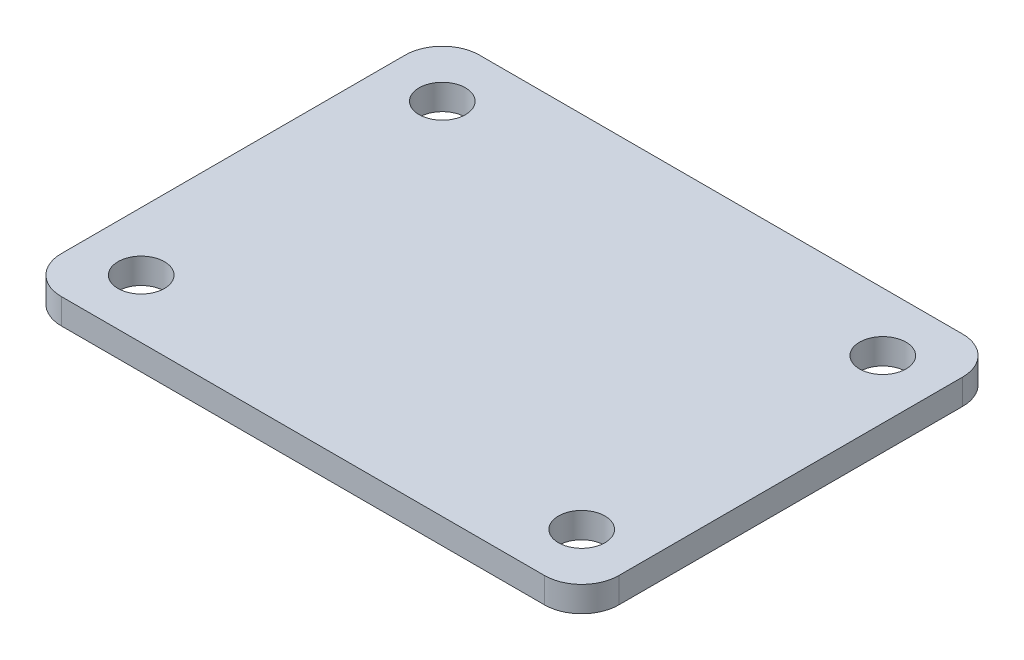
ISO-10303-21;
HEADER;
FILE_DESCRIPTION(('STEP AP214'),'2;1');
FILE_NAME('part.step','',(''),(''),'','','');
FILE_SCHEMA(('AUTOMOTIVE_DESIGN { 1 0 10303 214 1 1 1 1 }'));
ENDSEC;
DATA;
#1=APPLICATION_CONTEXT('core data for automotive mechanical design processes');
#2=APPLICATION_PROTOCOL_DEFINITION('international standard','automotive_design',2000,#1);
#3=PRODUCT_CONTEXT('',#1,'mechanical');
#4=PRODUCT('Part','Part','',(#3));
#5=PRODUCT_RELATED_PRODUCT_CATEGORY('part','',(#4));
#6=PRODUCT_DEFINITION_FORMATION('','',#4);
#7=PRODUCT_DEFINITION_CONTEXT('part definition',#1,'design');
#8=PRODUCT_DEFINITION('design','',#6,#7);
#9=PRODUCT_DEFINITION_SHAPE('','',#8);
#10=(LENGTH_UNIT() NAMED_UNIT(*) SI_UNIT(.MILLI.,.METRE.));
#11=(NAMED_UNIT(*) PLANE_ANGLE_UNIT() SI_UNIT($,.RADIAN.));
#12=(NAMED_UNIT(*) SI_UNIT($,.STERADIAN.) SOLID_ANGLE_UNIT());
#13=UNCERTAINTY_MEASURE_WITH_UNIT(LENGTH_MEASURE(1.E-05),#10,'distance_accuracy_value','');
#14=(GEOMETRIC_REPRESENTATION_CONTEXT(3) GLOBAL_UNCERTAINTY_ASSIGNED_CONTEXT((#13)) GLOBAL_UNIT_ASSIGNED_CONTEXT((#10,
#11,#12)) REPRESENTATION_CONTEXT('',''));
#15=CARTESIAN_POINT('',(0.,0.,0.));
#16=DIRECTION('',(0.,0.,1.));
#17=DIRECTION('',(1.,0.,0.));
#18=AXIS2_PLACEMENT_3D('',#15,#16,#17);
#19=CARTESIAN_POINT('',(0.,1.7399,0.));
#20=DIRECTION('',(1.,0.,0.));
#21=DIRECTION('',(0.,0.,-1.));
#22=AXIS2_PLACEMENT_3D('',#19,#20,#21);
#23=PLANE('',#22);
#24=DIRECTION('',(0.,0.,1.));
#25=VECTOR('',#24,1.);
#26=CARTESIAN_POINT('',(0.,0.,0.));
#27=LINE('',#26,#25);
#28=CARTESIAN_POINT('',(0.,0.,-26.035));
#29=VERTEX_POINT('',#28);
#30=CARTESIAN_POINT('',(0.,0.,-2.54));
#31=VERTEX_POINT('',#30);
#32=EDGE_CURVE('E186',#29,#31,#27,.T.);
#33=ORIENTED_EDGE('',*,*,#32,.T.);
#34=DIRECTION('',(0.,-1.,0.));
#35=VECTOR('',#34,1.);
#36=CARTESIAN_POINT('',(0.,1.7399,-2.54));
#37=LINE('',#36,#35);
#38=CARTESIAN_POINT('',(0.,1.7399,-2.54));
#39=VERTEX_POINT('',#38);
#40=EDGE_CURVE('E11',#31,#39,#37,.F.);
#41=ORIENTED_EDGE('',*,*,#40,.T.);
#42=DIRECTION('',(0.,0.,1.));
#43=VECTOR('',#42,1.);
#44=CARTESIAN_POINT('',(0.,1.7399,0.));
#45=LINE('',#44,#43);
#46=CARTESIAN_POINT('',(0.,1.7399,-26.035));
#47=VERTEX_POINT('',#46);
#48=EDGE_CURVE('E139',#47,#39,#45,.T.);
#49=ORIENTED_EDGE('',*,*,#48,.F.);
#50=DIRECTION('',(0.,-1.,0.));
#51=VECTOR('',#50,1.);
#52=CARTESIAN_POINT('',(0.,1.7399,-26.035));
#53=LINE('',#52,#51);
#54=EDGE_CURVE('E52',#47,#29,#53,.T.);
#55=ORIENTED_EDGE('',*,*,#54,.T.);
#56=EDGE_LOOP('',(#33,#41,#49,#55));
#57=FACE_BOUND('',#56,.T.);
#58=ADVANCED_FACE('F43',(#57),#23,.F.);
#59=CARTESIAN_POINT('',(0.,1.7399,0.));
#60=DIRECTION('',(0.,0.,-1.));
#61=DIRECTION('',(-1.,0.,0.));
#62=AXIS2_PLACEMENT_3D('',#59,#60,#61);
#63=PLANE('',#62);
#64=DIRECTION('',(1.,0.,0.));
#65=VECTOR('',#64,1.);
#66=CARTESIAN_POINT('',(0.,0.,0.));
#67=LINE('',#66,#65);
#68=CARTESIAN_POINT('',(2.54,0.,0.));
#69=VERTEX_POINT('',#68);
#70=CARTESIAN_POINT('',(35.56,0.,0.));
#71=VERTEX_POINT('',#70);
#72=EDGE_CURVE('E146',#69,#71,#67,.T.);
#73=ORIENTED_EDGE('',*,*,#72,.T.);
#74=DIRECTION('',(0.,-1.,0.));
#75=VECTOR('',#74,1.);
#76=CARTESIAN_POINT('',(35.56,1.7399,0.));
#77=LINE('',#76,#75);
#78=CARTESIAN_POINT('',(35.56,1.7399,0.));
#79=VERTEX_POINT('',#78);
#80=EDGE_CURVE('E59',#71,#79,#77,.F.);
#81=ORIENTED_EDGE('',*,*,#80,.T.);
#82=DIRECTION('',(1.,0.,0.));
#83=VECTOR('',#82,1.);
#84=CARTESIAN_POINT('',(0.,1.7399,0.));
#85=LINE('',#84,#83);
#86=CARTESIAN_POINT('',(2.54,1.7399,0.));
#87=VERTEX_POINT('',#86);
#88=EDGE_CURVE('E144',#87,#79,#85,.T.);
#89=ORIENTED_EDGE('',*,*,#88,.F.);
#90=DIRECTION('',(0.,-1.,0.));
#91=VECTOR('',#90,1.);
#92=CARTESIAN_POINT('',(2.54,1.7399,0.));
#93=LINE('',#92,#91);
#94=EDGE_CURVE('E175',#87,#69,#93,.T.);
#95=ORIENTED_EDGE('',*,*,#94,.T.);
#96=EDGE_LOOP('',(#73,#81,#89,#95));
#97=FACE_BOUND('',#96,.T.);
#98=ADVANCED_FACE('F251',(#97),#63,.F.);
#99=CARTESIAN_POINT('',(38.1,1.7399,0.));
#100=DIRECTION('',(-1.,0.,0.));
#101=DIRECTION('',(0.,0.,1.));
#102=AXIS2_PLACEMENT_3D('',#99,#100,#101);
#103=PLANE('',#102);
#104=DIRECTION('',(0.,0.,-1.));
#105=VECTOR('',#104,1.);
#106=CARTESIAN_POINT('',(38.1,0.,0.));
#107=LINE('',#106,#105);
#108=CARTESIAN_POINT('',(38.1,0.,-2.54));
#109=VERTEX_POINT('',#108);
#110=CARTESIAN_POINT('',(38.1,0.,-26.035));
#111=VERTEX_POINT('',#110);
#112=EDGE_CURVE('E140',#109,#111,#107,.T.);
#113=ORIENTED_EDGE('',*,*,#112,.T.);
#114=DIRECTION('',(0.,-1.,0.));
#115=VECTOR('',#114,1.);
#116=CARTESIAN_POINT('',(38.1,1.7399,-26.035));
#117=LINE('',#116,#115);
#118=CARTESIAN_POINT('',(38.1,1.7399,-26.035));
#119=VERTEX_POINT('',#118);
#120=EDGE_CURVE('E115',#111,#119,#117,.F.);
#121=ORIENTED_EDGE('',*,*,#120,.T.);
#122=DIRECTION('',(0.,0.,-1.));
#123=VECTOR('',#122,1.);
#124=CARTESIAN_POINT('',(38.1,1.7399,0.));
#125=LINE('',#124,#123);
#126=CARTESIAN_POINT('',(38.1,1.7399,-2.54));
#127=VERTEX_POINT('',#126);
#128=EDGE_CURVE('E202',#127,#119,#125,.T.);
#129=ORIENTED_EDGE('',*,*,#128,.F.);
#130=DIRECTION('',(0.,-1.,0.));
#131=VECTOR('',#130,1.);
#132=CARTESIAN_POINT('',(38.1,1.7399,-2.54));
#133=LINE('',#132,#131);
#134=EDGE_CURVE('E121',#127,#109,#133,.T.);
#135=ORIENTED_EDGE('',*,*,#134,.T.);
#136=EDGE_LOOP('',(#113,#121,#129,#135));
#137=FACE_BOUND('',#136,.T.);
#138=ADVANCED_FACE('F248',(#137),#103,.F.);
#139=CARTESIAN_POINT('',(0.,1.7399,-28.575));
#140=DIRECTION('',(0.,0.,1.));
#141=DIRECTION('',(1.,0.,0.));
#142=AXIS2_PLACEMENT_3D('',#139,#140,#141);
#143=PLANE('',#142);
#144=DIRECTION('',(-1.,0.,0.));
#145=VECTOR('',#144,1.);
#146=CARTESIAN_POINT('',(0.,1.7399,-28.575));
#147=LINE('',#146,#145);
#148=CARTESIAN_POINT('',(35.56,1.7399,-28.575));
#149=VERTEX_POINT('',#148);
#150=CARTESIAN_POINT('',(2.54,1.7399,-28.575));
#151=VERTEX_POINT('',#150);
#152=EDGE_CURVE('E131',#149,#151,#147,.T.);
#153=ORIENTED_EDGE('',*,*,#152,.F.);
#154=DIRECTION('',(0.,-1.,0.));
#155=VECTOR('',#154,1.);
#156=CARTESIAN_POINT('',(35.56,1.7399,-28.575));
#157=LINE('',#156,#155);
#158=CARTESIAN_POINT('',(35.56,0.,-28.575));
#159=VERTEX_POINT('',#158);
#160=EDGE_CURVE('E114',#149,#159,#157,.T.);
#161=ORIENTED_EDGE('',*,*,#160,.T.);
#162=DIRECTION('',(-1.,0.,0.));
#163=VECTOR('',#162,1.);
#164=CARTESIAN_POINT('',(0.,0.,-28.575));
#165=LINE('',#164,#163);
#166=CARTESIAN_POINT('',(2.54,0.,-28.575));
#167=VERTEX_POINT('',#166);
#168=EDGE_CURVE('E128',#159,#167,#165,.T.);
#169=ORIENTED_EDGE('',*,*,#168,.T.);
#170=DIRECTION('',(0.,-1.,0.));
#171=VECTOR('',#170,1.);
#172=CARTESIAN_POINT('',(2.54,1.7399,-28.575));
#173=LINE('',#172,#171);
#174=EDGE_CURVE('E134',#167,#151,#173,.F.);
#175=ORIENTED_EDGE('',*,*,#174,.T.);
#176=EDGE_LOOP('',(#153,#161,#169,#175));
#177=FACE_BOUND('',#176,.T.);
#178=ADVANCED_FACE('F127',(#177),#143,.F.);
#179=CARTESIAN_POINT('',(0.,1.7399,0.));
#180=DIRECTION('',(0.,-1.,0.));
#181=DIRECTION('',(0.,0.,-1.));
#182=AXIS2_PLACEMENT_3D('',#179,#180,#181);
#183=PLANE('',#182);
#184=CARTESIAN_POINT('',(34.0995,1.7399,-4.0005));
#185=DIRECTION('',(0.,1.,0.));
#186=DIRECTION('',(0.,0.,1.));
#187=AXIS2_PLACEMENT_3D('',#184,#185,#186);
#188=CIRCLE('',#187,1.5875);
#189=CARTESIAN_POINT('',(34.0995,1.7399,-2.413));
#190=VERTEX_POINT('',#189);
#191=EDGE_CURVE('E210',#190,#190,#188,.T.);
#192=ORIENTED_EDGE('',*,*,#191,.F.);
#193=EDGE_LOOP('',(#192));
#194=FACE_BOUND('',#193,.T.);
#195=CARTESIAN_POINT('',(4.0005,1.7399,-24.5745));
#196=DIRECTION('',(0.,1.,0.));
#197=DIRECTION('',(0.,0.,1.));
#198=AXIS2_PLACEMENT_3D('',#195,#196,#197);
#199=CIRCLE('',#198,1.5875);
#200=CARTESIAN_POINT('',(4.0005,1.7399,-22.987));
#201=VERTEX_POINT('',#200);
#202=EDGE_CURVE('E216',#201,#201,#199,.T.);
#203=ORIENTED_EDGE('',*,*,#202,.F.);
#204=EDGE_LOOP('',(#203));
#205=FACE_BOUND('',#204,.T.);
#206=CARTESIAN_POINT('',(34.0995,1.7399,-24.5745));
#207=DIRECTION('',(0.,1.,0.));
#208=DIRECTION('',(0.,0.,1.));
#209=AXIS2_PLACEMENT_3D('',#206,#207,#208);
#210=CIRCLE('',#209,1.5875);
#211=CARTESIAN_POINT('',(34.0995,1.7399,-22.987));
#212=VERTEX_POINT('',#211);
#213=EDGE_CURVE('E217',#212,#212,#210,.T.);
#214=ORIENTED_EDGE('',*,*,#213,.F.);
#215=EDGE_LOOP('',(#214));
#216=FACE_BOUND('',#215,.T.);
#217=CARTESIAN_POINT('',(4.0005,1.7399,-4.0005));
#218=DIRECTION('',(0.,1.,0.));
#219=DIRECTION('',(0.,0.,1.));
#220=AXIS2_PLACEMENT_3D('',#217,#218,#219);
#221=CIRCLE('',#220,1.5875);
#222=CARTESIAN_POINT('',(4.0005,1.7399,-2.413));
#223=VERTEX_POINT('',#222);
#224=EDGE_CURVE('E197',#223,#223,#221,.T.);
#225=ORIENTED_EDGE('',*,*,#224,.F.);
#226=EDGE_LOOP('',(#225));
#227=FACE_BOUND('',#226,.T.);
#228=ORIENTED_EDGE('',*,*,#128,.T.);
#229=CARTESIAN_POINT('',(35.56,1.7399,-26.035));
#230=DIRECTION('',(0.,-1.,0.));
#231=DIRECTION('',(0.,0.,-1.));
#232=AXIS2_PLACEMENT_3D('',#229,#230,#231);
#233=CIRCLE('',#232,2.54);
#234=EDGE_CURVE('E172',#119,#149,#233,.F.);
#235=ORIENTED_EDGE('',*,*,#234,.T.);
#236=ORIENTED_EDGE('',*,*,#152,.T.);
#237=CARTESIAN_POINT('',(2.54,1.7399,-26.035));
#238=DIRECTION('',(0.,-1.,0.));
#239=DIRECTION('',(0.,0.,-1.));
#240=AXIS2_PLACEMENT_3D('',#237,#238,#239);
#241=CIRCLE('',#240,2.54);
#242=EDGE_CURVE('E164',#151,#47,#241,.F.);
#243=ORIENTED_EDGE('',*,*,#242,.T.);
#244=ORIENTED_EDGE('',*,*,#48,.T.);
#245=CARTESIAN_POINT('',(2.54,1.7399,-2.54));
#246=DIRECTION('',(0.,-1.,0.));
#247=DIRECTION('',(0.,0.,-1.));
#248=AXIS2_PLACEMENT_3D('',#245,#246,#247);
#249=CIRCLE('',#248,2.54);
#250=EDGE_CURVE('E66',#39,#87,#249,.F.);
#251=ORIENTED_EDGE('',*,*,#250,.T.);
#252=ORIENTED_EDGE('',*,*,#88,.T.);
#253=CARTESIAN_POINT('',(35.56,1.7399,-2.54));
#254=DIRECTION('',(0.,-1.,0.));
#255=DIRECTION('',(0.,0.,-1.));
#256=AXIS2_PLACEMENT_3D('',#253,#254,#255);
#257=CIRCLE('',#256,2.54);
#258=EDGE_CURVE('E169',#79,#127,#257,.F.);
#259=ORIENTED_EDGE('',*,*,#258,.T.);
#260=EDGE_LOOP('',(#228,#235,#236,#243,#244,#251,#252,#259));
#261=FACE_BOUND('',#260,.T.);
#262=ADVANCED_FACE('F238',(#194,#205,#216,#227,#261),#183,.F.);
#263=CARTESIAN_POINT('',(0.,0.,0.));
#264=DIRECTION('',(0.,-1.,0.));
#265=DIRECTION('',(0.,0.,-1.));
#266=AXIS2_PLACEMENT_3D('',#263,#264,#265);
#267=PLANE('',#266);
#268=CARTESIAN_POINT('',(34.0995,0.,-4.0005));
#269=DIRECTION('',(0.,1.,0.));
#270=DIRECTION('',(0.,0.,1.));
#271=AXIS2_PLACEMENT_3D('',#268,#269,#270);
#272=CIRCLE('',#271,1.5875);
#273=CARTESIAN_POINT('',(34.0995,0.,-2.413));
#274=VERTEX_POINT('',#273);
#275=EDGE_CURVE('E221',#274,#274,#272,.T.);
#276=ORIENTED_EDGE('',*,*,#275,.T.);
#277=EDGE_LOOP('',(#276));
#278=FACE_BOUND('',#277,.T.);
#279=CARTESIAN_POINT('',(4.0005,0.,-24.5745));
#280=DIRECTION('',(0.,1.,0.));
#281=DIRECTION('',(0.,0.,1.));
#282=AXIS2_PLACEMENT_3D('',#279,#280,#281);
#283=CIRCLE('',#282,1.5875);
#284=CARTESIAN_POINT('',(4.0005,0.,-22.987));
#285=VERTEX_POINT('',#284);
#286=EDGE_CURVE('E212',#285,#285,#283,.T.);
#287=ORIENTED_EDGE('',*,*,#286,.T.);
#288=EDGE_LOOP('',(#287));
#289=FACE_BOUND('',#288,.T.);
#290=CARTESIAN_POINT('',(34.0995,0.,-24.5745));
#291=DIRECTION('',(0.,1.,0.));
#292=DIRECTION('',(0.,0.,1.));
#293=AXIS2_PLACEMENT_3D('',#290,#291,#292);
#294=CIRCLE('',#293,1.5875);
#295=CARTESIAN_POINT('',(34.0995,0.,-22.987));
#296=VERTEX_POINT('',#295);
#297=EDGE_CURVE('E228',#296,#296,#294,.T.);
#298=ORIENTED_EDGE('',*,*,#297,.T.);
#299=EDGE_LOOP('',(#298));
#300=FACE_BOUND('',#299,.T.);
#301=CARTESIAN_POINT('',(4.0005,0.,-4.0005));
#302=DIRECTION('',(0.,1.,0.));
#303=DIRECTION('',(0.,0.,1.));
#304=AXIS2_PLACEMENT_3D('',#301,#302,#303);
#305=CIRCLE('',#304,1.5875);
#306=CARTESIAN_POINT('',(4.0005,0.,-2.413));
#307=VERTEX_POINT('',#306);
#308=EDGE_CURVE('E192',#307,#307,#305,.T.);
#309=ORIENTED_EDGE('',*,*,#308,.T.);
#310=EDGE_LOOP('',(#309));
#311=FACE_BOUND('',#310,.T.);
#312=ORIENTED_EDGE('',*,*,#168,.F.);
#313=CARTESIAN_POINT('',(35.56,0.,-26.035));
#314=DIRECTION('',(0.,-1.,0.));
#315=DIRECTION('',(0.,0.,-1.));
#316=AXIS2_PLACEMENT_3D('',#313,#314,#315);
#317=CIRCLE('',#316,2.54);
#318=EDGE_CURVE('E110',#159,#111,#317,.T.);
#319=ORIENTED_EDGE('',*,*,#318,.T.);
#320=ORIENTED_EDGE('',*,*,#112,.F.);
#321=CARTESIAN_POINT('',(35.56,0.,-2.54));
#322=DIRECTION('',(0.,-1.,0.));
#323=DIRECTION('',(0.,0.,-1.));
#324=AXIS2_PLACEMENT_3D('',#321,#322,#323);
#325=CIRCLE('',#324,2.54);
#326=EDGE_CURVE('E122',#109,#71,#325,.T.);
#327=ORIENTED_EDGE('',*,*,#326,.T.);
#328=ORIENTED_EDGE('',*,*,#72,.F.);
#329=CARTESIAN_POINT('',(2.54,0.,-2.54));
#330=DIRECTION('',(0.,-1.,0.));
#331=DIRECTION('',(0.,0.,-1.));
#332=AXIS2_PLACEMENT_3D('',#329,#330,#331);
#333=CIRCLE('',#332,2.54);
#334=EDGE_CURVE('E154',#69,#31,#333,.T.);
#335=ORIENTED_EDGE('',*,*,#334,.T.);
#336=ORIENTED_EDGE('',*,*,#32,.F.);
#337=CARTESIAN_POINT('',(2.54,0.,-26.035));
#338=DIRECTION('',(0.,-1.,0.));
#339=DIRECTION('',(0.,0.,-1.));
#340=AXIS2_PLACEMENT_3D('',#337,#338,#339);
#341=CIRCLE('',#340,2.54);
#342=EDGE_CURVE('E133',#29,#167,#341,.T.);
#343=ORIENTED_EDGE('',*,*,#342,.T.);
#344=EDGE_LOOP('',(#312,#319,#320,#327,#328,#335,#336,#343));
#345=FACE_BOUND('',#344,.T.);
#346=ADVANCED_FACE('F136',(#278,#289,#300,#311,#345),#267,.T.);
#347=CARTESIAN_POINT('',(4.0005,0.,-4.0005));
#348=DIRECTION('',(0.,1.,0.));
#349=DIRECTION('',(0.,0.,1.));
#350=AXIS2_PLACEMENT_3D('',#347,#348,#349);
#351=CYLINDRICAL_SURFACE('',#350,1.5875);
#352=ORIENTED_EDGE('',*,*,#308,.F.);
#353=EDGE_LOOP('',(#352));
#354=FACE_BOUND('',#353,.T.);
#355=ORIENTED_EDGE('',*,*,#224,.T.);
#356=EDGE_LOOP('',(#355));
#357=FACE_BOUND('',#356,.T.);
#358=ADVANCED_FACE('F324',(#354,#357),#351,.F.);
#359=CARTESIAN_POINT('',(34.0995,0.,-24.5745));
#360=DIRECTION('',(0.,1.,0.));
#361=DIRECTION('',(0.,0.,1.));
#362=AXIS2_PLACEMENT_3D('',#359,#360,#361);
#363=CYLINDRICAL_SURFACE('',#362,1.5875);
#364=ORIENTED_EDGE('',*,*,#297,.F.);
#365=EDGE_LOOP('',(#364));
#366=FACE_BOUND('',#365,.T.);
#367=ORIENTED_EDGE('',*,*,#213,.T.);
#368=EDGE_LOOP('',(#367));
#369=FACE_BOUND('',#368,.T.);
#370=ADVANCED_FACE('F236',(#366,#369),#363,.F.);
#371=CARTESIAN_POINT('',(4.0005,0.,-24.5745));
#372=DIRECTION('',(0.,1.,0.));
#373=DIRECTION('',(0.,0.,1.));
#374=AXIS2_PLACEMENT_3D('',#371,#372,#373);
#375=CYLINDRICAL_SURFACE('',#374,1.5875);
#376=ORIENTED_EDGE('',*,*,#286,.F.);
#377=EDGE_LOOP('',(#376));
#378=FACE_BOUND('',#377,.T.);
#379=ORIENTED_EDGE('',*,*,#202,.T.);
#380=EDGE_LOOP('',(#379));
#381=FACE_BOUND('',#380,.T.);
#382=ADVANCED_FACE('F305',(#378,#381),#375,.F.);
#383=CARTESIAN_POINT('',(34.0995,0.,-4.0005));
#384=DIRECTION('',(0.,1.,0.));
#385=DIRECTION('',(0.,0.,1.));
#386=AXIS2_PLACEMENT_3D('',#383,#384,#385);
#387=CYLINDRICAL_SURFACE('',#386,1.5875);
#388=ORIENTED_EDGE('',*,*,#275,.F.);
#389=EDGE_LOOP('',(#388));
#390=FACE_BOUND('',#389,.T.);
#391=ORIENTED_EDGE('',*,*,#191,.T.);
#392=EDGE_LOOP('',(#391));
#393=FACE_BOUND('',#392,.T.);
#394=ADVANCED_FACE('F269',(#390,#393),#387,.F.);
#395=CARTESIAN_POINT('',(35.56,1.7399,-26.035));
#396=DIRECTION('',(0.,-1.,0.));
#397=DIRECTION('',(0.,0.,-1.));
#398=AXIS2_PLACEMENT_3D('',#395,#396,#397);
#399=CYLINDRICAL_SURFACE('',#398,2.54);
#400=ORIENTED_EDGE('',*,*,#234,.F.);
#401=ORIENTED_EDGE('',*,*,#120,.F.);
#402=ORIENTED_EDGE('',*,*,#318,.F.);
#403=ORIENTED_EDGE('',*,*,#160,.F.);
#404=EDGE_LOOP('',(#400,#401,#402,#403));
#405=FACE_BOUND('',#404,.T.);
#406=ADVANCED_FACE('F113',(#405),#399,.T.);
#407=CARTESIAN_POINT('',(35.56,1.7399,-2.54));
#408=DIRECTION('',(0.,-1.,0.));
#409=DIRECTION('',(0.,0.,-1.));
#410=AXIS2_PLACEMENT_3D('',#407,#408,#409);
#411=CYLINDRICAL_SURFACE('',#410,2.54);
#412=ORIENTED_EDGE('',*,*,#258,.F.);
#413=ORIENTED_EDGE('',*,*,#80,.F.);
#414=ORIENTED_EDGE('',*,*,#326,.F.);
#415=ORIENTED_EDGE('',*,*,#134,.F.);
#416=EDGE_LOOP('',(#412,#413,#414,#415));
#417=FACE_BOUND('',#416,.T.);
#418=ADVANCED_FACE('F250',(#417),#411,.T.);
#419=CARTESIAN_POINT('',(2.54,1.7399,-2.54));
#420=DIRECTION('',(0.,-1.,0.));
#421=DIRECTION('',(0.,0.,-1.));
#422=AXIS2_PLACEMENT_3D('',#419,#420,#421);
#423=CYLINDRICAL_SURFACE('',#422,2.54);
#424=ORIENTED_EDGE('',*,*,#250,.F.);
#425=ORIENTED_EDGE('',*,*,#40,.F.);
#426=ORIENTED_EDGE('',*,*,#334,.F.);
#427=ORIENTED_EDGE('',*,*,#94,.F.);
#428=EDGE_LOOP('',(#424,#425,#426,#427));
#429=FACE_BOUND('',#428,.T.);
#430=ADVANCED_FACE('F254',(#429),#423,.T.);
#431=CARTESIAN_POINT('',(2.54,1.7399,-26.035));
#432=DIRECTION('',(0.,-1.,0.));
#433=DIRECTION('',(0.,0.,-1.));
#434=AXIS2_PLACEMENT_3D('',#431,#432,#433);
#435=CYLINDRICAL_SURFACE('',#434,2.54);
#436=ORIENTED_EDGE('',*,*,#242,.F.);
#437=ORIENTED_EDGE('',*,*,#174,.F.);
#438=ORIENTED_EDGE('',*,*,#342,.F.);
#439=ORIENTED_EDGE('',*,*,#54,.F.);
#440=EDGE_LOOP('',(#436,#437,#438,#439));
#441=FACE_BOUND('',#440,.T.);
#442=ADVANCED_FACE('F45',(#441),#435,.T.);
#443=CLOSED_SHELL('',(#58,#98,#138,#178,#262,#346,#358,#370,#382,#394,#406,#418,#430,#442));
#444=MANIFOLD_SOLID_BREP('B2',#443);
#445=ADVANCED_BREP_SHAPE_REPRESENTATION('',(#18,#444),#14);
#446=SHAPE_DEFINITION_REPRESENTATION(#9,#445);
ENDSEC;
END-ISO-10303-21;
